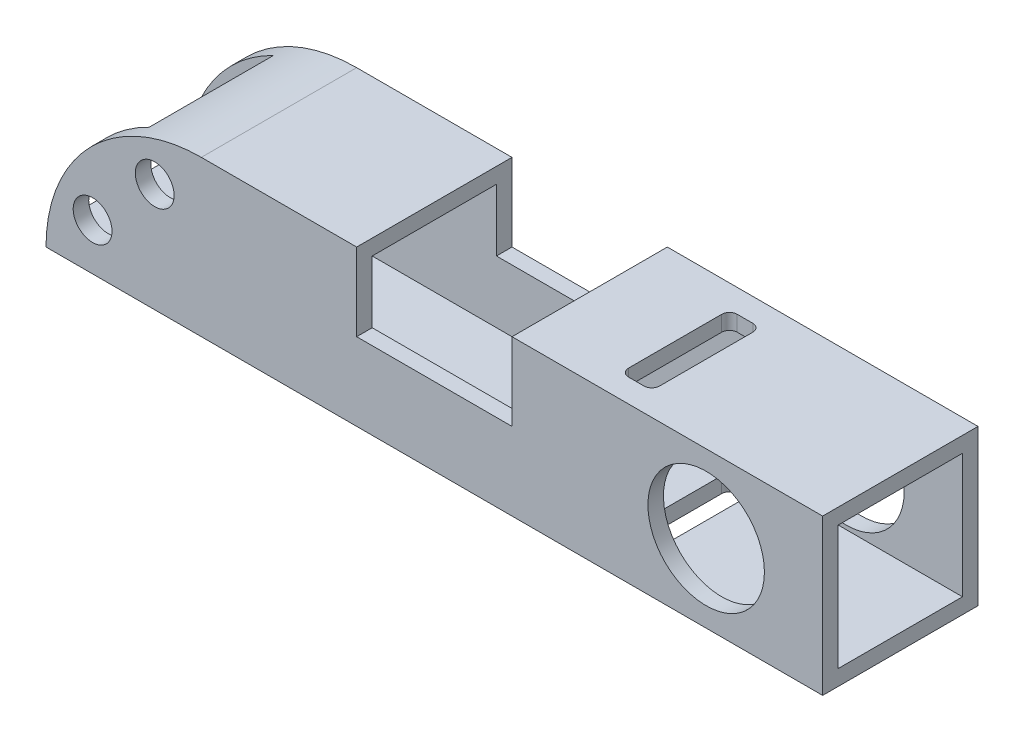
ISO-10303-21;
HEADER;
FILE_DESCRIPTION(('STEP AP214'),'2;1');
FILE_NAME('part.step','',(''),(''),'','','');
FILE_SCHEMA(('AUTOMOTIVE_DESIGN { 1 0 10303 214 1 1 1 1 }'));
ENDSEC;
DATA;
#1=APPLICATION_CONTEXT('core data for automotive mechanical design processes');
#2=APPLICATION_PROTOCOL_DEFINITION('international standard','automotive_design',2000,#1);
#3=PRODUCT_CONTEXT('',#1,'mechanical');
#4=PRODUCT('Part','Part','',(#3));
#5=PRODUCT_RELATED_PRODUCT_CATEGORY('part','',(#4));
#6=PRODUCT_DEFINITION_FORMATION('','',#4);
#7=PRODUCT_DEFINITION_CONTEXT('part definition',#1,'design');
#8=PRODUCT_DEFINITION('design','',#6,#7);
#9=PRODUCT_DEFINITION_SHAPE('','',#8);
#10=(LENGTH_UNIT() NAMED_UNIT(*) SI_UNIT(.MILLI.,.METRE.));
#11=(NAMED_UNIT(*) PLANE_ANGLE_UNIT() SI_UNIT($,.RADIAN.));
#12=(NAMED_UNIT(*) SI_UNIT($,.STERADIAN.) SOLID_ANGLE_UNIT());
#13=UNCERTAINTY_MEASURE_WITH_UNIT(LENGTH_MEASURE(1.E-05),#10,'distance_accuracy_value','');
#14=(GEOMETRIC_REPRESENTATION_CONTEXT(3) GLOBAL_UNCERTAINTY_ASSIGNED_CONTEXT((#13)) GLOBAL_UNIT_ASSIGNED_CONTEXT((#10,
#11,#12)) REPRESENTATION_CONTEXT('',''));
#15=CARTESIAN_POINT('',(0.,0.,0.));
#16=DIRECTION('',(0.,0.,1.));
#17=DIRECTION('',(1.,0.,0.));
#18=AXIS2_PLACEMENT_3D('',#15,#16,#17);
#19=CARTESIAN_POINT('',(127.,25.4,0.));
#20=DIRECTION('',(0.,-1.,0.));
#21=DIRECTION('',(0.,0.,-1.));
#22=AXIS2_PLACEMENT_3D('',#19,#20,#21);
#23=PLANE('',#22);
#24=DIRECTION('',(-1.,0.,0.));
#25=VECTOR('',#24,1.);
#26=CARTESIAN_POINT('',(127.,25.4,-25.4));
#27=LINE('',#26,#25);
#28=CARTESIAN_POINT('',(50.8,25.4,-25.4));
#29=VERTEX_POINT('',#28);
#30=CARTESIAN_POINT('',(25.4,25.4,-25.4));
#31=VERTEX_POINT('',#30);
#32=EDGE_CURVE('E534',#29,#31,#27,.T.);
#33=ORIENTED_EDGE('',*,*,#32,.T.);
#34=DIRECTION('',(0.,0.,1.));
#35=VECTOR('',#34,1.);
#36=CARTESIAN_POINT('',(25.4,25.4,0.));
#37=LINE('',#36,#35);
#38=CARTESIAN_POINT('',(25.4,25.4,0.));
#39=VERTEX_POINT('',#38);
#40=EDGE_CURVE('E558',#31,#39,#37,.T.);
#41=ORIENTED_EDGE('',*,*,#40,.T.);
#42=DIRECTION('',(-1.,0.,0.));
#43=VECTOR('',#42,1.);
#44=CARTESIAN_POINT('',(127.,25.4,0.));
#45=LINE('',#44,#43);
#46=CARTESIAN_POINT('',(50.8,25.4,0.));
#47=VERTEX_POINT('',#46);
#48=EDGE_CURVE('E527',#47,#39,#45,.T.);
#49=ORIENTED_EDGE('',*,*,#48,.F.);
#50=DIRECTION('',(0.,0.,1.));
#51=VECTOR('',#50,1.);
#52=CARTESIAN_POINT('',(50.8,25.4,-127.));
#53=LINE('',#52,#51);
#54=EDGE_CURVE('E439',#29,#47,#53,.T.);
#55=ORIENTED_EDGE('',*,*,#54,.F.);
#56=EDGE_LOOP('',(#33,#41,#49,#55));
#57=FACE_BOUND('',#56,.T.);
#58=ADVANCED_FACE('F50',(#57),#23,.F.);
#59=CARTESIAN_POINT('',(127.,22.86,-2.54));
#60=DIRECTION('',(0.,-1.,0.));
#61=DIRECTION('',(0.,0.,-1.));
#62=AXIS2_PLACEMENT_3D('',#59,#60,#61);
#63=PLANE('',#62);
#64=DIRECTION('',(0.,0.,-1.));
#65=VECTOR('',#64,1.);
#66=CARTESIAN_POINT('',(50.8,22.86,-2.54));
#67=LINE('',#66,#65);
#68=CARTESIAN_POINT('',(50.8,22.86,-2.54));
#69=VERTEX_POINT('',#68);
#70=CARTESIAN_POINT('',(50.8,22.86,-22.86));
#71=VERTEX_POINT('',#70);
#72=EDGE_CURVE('E549',#69,#71,#67,.T.);
#73=ORIENTED_EDGE('',*,*,#72,.F.);
#74=DIRECTION('',(-1.,0.,0.));
#75=VECTOR('',#74,1.);
#76=CARTESIAN_POINT('',(127.,22.86,-2.54));
#77=LINE('',#76,#75);
#78=CARTESIAN_POINT('',(14.3283966834067,22.86,-2.54));
#79=VERTEX_POINT('',#78);
#80=EDGE_CURVE('E497',#69,#79,#77,.T.);
#81=ORIENTED_EDGE('',*,*,#80,.T.);
#82=DIRECTION('',(0.,0.,-1.));
#83=VECTOR('',#82,1.);
#84=CARTESIAN_POINT('',(14.3283966834067,22.86,-12.7));
#85=LINE('',#84,#83);
#86=CARTESIAN_POINT('',(14.3283966834067,22.86,-22.86));
#87=VERTEX_POINT('',#86);
#88=EDGE_CURVE('E486',#87,#79,#85,.F.);
#89=ORIENTED_EDGE('',*,*,#88,.F.);
#90=DIRECTION('',(-1.,0.,0.));
#91=VECTOR('',#90,1.);
#92=CARTESIAN_POINT('',(127.,22.86,-22.86));
#93=LINE('',#92,#91);
#94=EDGE_CURVE('E503',#71,#87,#93,.T.);
#95=ORIENTED_EDGE('',*,*,#94,.F.);
#96=EDGE_LOOP('',(#73,#81,#89,#95));
#97=FACE_BOUND('',#96,.T.);
#98=ADVANCED_FACE('F912',(#97),#63,.T.);
#99=CARTESIAN_POINT('',(127.,25.4,0.));
#100=DIRECTION('',(-1.,0.,0.));
#101=DIRECTION('',(0.,0.,1.));
#102=AXIS2_PLACEMENT_3D('',#99,#100,#101);
#103=PLANE('',#102);
#104=DIRECTION('',(0.,-1.,0.));
#105=VECTOR('',#104,1.);
#106=CARTESIAN_POINT('',(127.,0.,0.));
#107=LINE('',#106,#105);
#108=CARTESIAN_POINT('',(127.,25.4,0.));
#109=VERTEX_POINT('',#108);
#110=CARTESIAN_POINT('',(127.,0.,0.));
#111=VERTEX_POINT('',#110);
#112=EDGE_CURVE('E514',#109,#111,#107,.T.);
#113=ORIENTED_EDGE('',*,*,#112,.T.);
#114=DIRECTION('',(0.,0.,-1.));
#115=VECTOR('',#114,1.);
#116=CARTESIAN_POINT('',(127.,0.,0.));
#117=LINE('',#116,#115);
#118=CARTESIAN_POINT('',(127.,0.,-25.4));
#119=VERTEX_POINT('',#118);
#120=EDGE_CURVE('E517',#111,#119,#117,.T.);
#121=ORIENTED_EDGE('',*,*,#120,.T.);
#122=DIRECTION('',(0.,1.,0.));
#123=VECTOR('',#122,1.);
#124=CARTESIAN_POINT('',(127.,0.,-25.4));
#125=LINE('',#124,#123);
#126=CARTESIAN_POINT('',(127.,25.4,-25.4));
#127=VERTEX_POINT('',#126);
#128=EDGE_CURVE('E524',#119,#127,#125,.T.);
#129=ORIENTED_EDGE('',*,*,#128,.T.);
#130=DIRECTION('',(0.,0.,1.));
#131=VECTOR('',#130,1.);
#132=CARTESIAN_POINT('',(127.,25.4,0.));
#133=LINE('',#132,#131);
#134=EDGE_CURVE('E523',#127,#109,#133,.T.);
#135=ORIENTED_EDGE('',*,*,#134,.T.);
#136=EDGE_LOOP('',(#113,#121,#129,#135));
#137=FACE_BOUND('',#136,.T.);
#138=DIRECTION('',(0.,-1.,0.));
#139=VECTOR('',#138,1.);
#140=CARTESIAN_POINT('',(127.,22.86,-2.54));
#141=LINE('',#140,#139);
#142=CARTESIAN_POINT('',(127.,22.86,-2.54));
#143=VERTEX_POINT('',#142);
#144=CARTESIAN_POINT('',(127.,2.54,-2.54));
#145=VERTEX_POINT('',#144);
#146=EDGE_CURVE('E485',#143,#145,#141,.T.);
#147=ORIENTED_EDGE('',*,*,#146,.F.);
#148=DIRECTION('',(0.,0.,1.));
#149=VECTOR('',#148,1.);
#150=CARTESIAN_POINT('',(127.,22.86,-2.54));
#151=LINE('',#150,#149);
#152=CARTESIAN_POINT('',(127.,22.86,-22.86));
#153=VERTEX_POINT('',#152);
#154=EDGE_CURVE('E492',#153,#143,#151,.T.);
#155=ORIENTED_EDGE('',*,*,#154,.F.);
#156=DIRECTION('',(0.,1.,0.));
#157=VECTOR('',#156,1.);
#158=CARTESIAN_POINT('',(127.,22.86,-22.86));
#159=LINE('',#158,#157);
#160=CARTESIAN_POINT('',(127.,2.54,-22.86));
#161=VERTEX_POINT('',#160);
#162=EDGE_CURVE('E487',#161,#153,#159,.T.);
#163=ORIENTED_EDGE('',*,*,#162,.F.);
#164=DIRECTION('',(0.,0.,-1.));
#165=VECTOR('',#164,1.);
#166=CARTESIAN_POINT('',(127.,2.54,-2.54));
#167=LINE('',#166,#165);
#168=EDGE_CURVE('E484',#145,#161,#167,.T.);
#169=ORIENTED_EDGE('',*,*,#168,.F.);
#170=EDGE_LOOP('',(#147,#155,#163,#169));
#171=FACE_BOUND('',#170,.T.);
#172=ADVANCED_FACE('F881',(#137,#171),#103,.F.);
#173=CARTESIAN_POINT('',(127.,0.,0.));
#174=DIRECTION('',(0.,0.,-1.));
#175=DIRECTION('',(-1.,0.,0.));
#176=AXIS2_PLACEMENT_3D('',#173,#174,#175);
#177=PLANE('',#176);
#178=CARTESIAN_POINT('',(107.95,12.7,0.));
#179=DIRECTION('',(0.,0.,1.));
#180=DIRECTION('',(1.,0.,0.));
#181=AXIS2_PLACEMENT_3D('',#178,#179,#180);
#182=CIRCLE('',#181,9.52500000000001);
#183=CARTESIAN_POINT('',(117.475,12.7,0.));
#184=VERTEX_POINT('',#183);
#185=EDGE_CURVE('E386',#184,#184,#182,.T.);
#186=ORIENTED_EDGE('',*,*,#185,.F.);
#187=EDGE_LOOP('',(#186));
#188=FACE_BOUND('',#187,.T.);
#189=CARTESIAN_POINT('',(17.78,17.78,0.));
#190=DIRECTION('',(0.,0.,1.));
#191=DIRECTION('',(1.,0.,0.));
#192=AXIS2_PLACEMENT_3D('',#189,#190,#191);
#193=CIRCLE('',#192,3.175);
#194=CARTESIAN_POINT('',(20.955,17.78,0.));
#195=VERTEX_POINT('',#194);
#196=EDGE_CURVE('E405',#195,#195,#193,.T.);
#197=ORIENTED_EDGE('',*,*,#196,.F.);
#198=EDGE_LOOP('',(#197));
#199=FACE_BOUND('',#198,.T.);
#200=CARTESIAN_POINT('',(7.62,7.62,0.));
#201=DIRECTION('',(0.,0.,1.));
#202=DIRECTION('',(1.,0.,0.));
#203=AXIS2_PLACEMENT_3D('',#200,#201,#202);
#204=CIRCLE('',#203,3.175);
#205=CARTESIAN_POINT('',(10.795,7.62,0.));
#206=VERTEX_POINT('',#205);
#207=EDGE_CURVE('E412',#206,#206,#204,.T.);
#208=ORIENTED_EDGE('',*,*,#207,.F.);
#209=EDGE_LOOP('',(#208));
#210=FACE_BOUND('',#209,.T.);
#211=ORIENTED_EDGE('',*,*,#48,.T.);
#212=CARTESIAN_POINT('',(25.4,0.,0.));
#213=DIRECTION('',(0.,0.,-1.));
#214=DIRECTION('',(-1.,0.,0.));
#215=AXIS2_PLACEMENT_3D('',#212,#213,#214);
#216=CIRCLE('',#215,25.4);
#217=CARTESIAN_POINT('',(0.,0.,0.));
#218=VERTEX_POINT('',#217);
#219=EDGE_CURVE('E556',#39,#218,#216,.F.);
#220=ORIENTED_EDGE('',*,*,#219,.T.);
#221=DIRECTION('',(-1.,0.,0.));
#222=VECTOR('',#221,1.);
#223=CARTESIAN_POINT('',(127.,0.,0.));
#224=LINE('',#223,#222);
#225=EDGE_CURVE('E543',#111,#218,#224,.T.);
#226=ORIENTED_EDGE('',*,*,#225,.F.);
#227=ORIENTED_EDGE('',*,*,#112,.F.);
#228=CARTESIAN_POINT('',(76.2,25.4,0.));
#229=VERTEX_POINT('',#228);
#230=EDGE_CURVE('E529',#109,#229,#45,.T.);
#231=ORIENTED_EDGE('',*,*,#230,.T.);
#232=DIRECTION('',(0.,1.,0.));
#233=VECTOR('',#232,1.);
#234=CARTESIAN_POINT('',(76.2,25.4,0.));
#235=LINE('',#234,#233);
#236=CARTESIAN_POINT('',(76.2,12.7,0.));
#237=VERTEX_POINT('',#236);
#238=EDGE_CURVE('E436',#237,#229,#235,.T.);
#239=ORIENTED_EDGE('',*,*,#238,.F.);
#240=DIRECTION('',(1.,0.,0.));
#241=VECTOR('',#240,1.);
#242=CARTESIAN_POINT('',(50.8,12.7,0.));
#243=LINE('',#242,#241);
#244=CARTESIAN_POINT('',(50.8,12.7,0.));
#245=VERTEX_POINT('',#244);
#246=EDGE_CURVE('E435',#245,#237,#243,.T.);
#247=ORIENTED_EDGE('',*,*,#246,.F.);
#248=DIRECTION('',(0.,-1.,0.));
#249=VECTOR('',#248,1.);
#250=CARTESIAN_POINT('',(50.8,25.4,0.));
#251=LINE('',#250,#249);
#252=EDGE_CURVE('E428',#47,#245,#251,.T.);
#253=ORIENTED_EDGE('',*,*,#252,.F.);
#254=EDGE_LOOP('',(#211,#220,#226,#227,#231,#239,#247,#253));
#255=FACE_BOUND('',#254,.T.);
#256=ADVANCED_FACE('F877',(#188,#199,#210,#255),#177,.F.);
#257=CARTESIAN_POINT('',(127.,0.,0.));
#258=DIRECTION('',(0.,1.,0.));
#259=DIRECTION('',(0.,0.,1.));
#260=AXIS2_PLACEMENT_3D('',#257,#258,#259);
#261=PLANE('',#260);
#262=DIRECTION('',(1.,0.,0.));
#263=VECTOR('',#262,1.);
#264=CARTESIAN_POINT('',(91.44,0.,-21.59));
#265=LINE('',#264,#263);
#266=CARTESIAN_POINT('',(91.44,0.,-21.59));
#267=VERTEX_POINT('',#266);
#268=CARTESIAN_POINT('',(93.98,0.,-21.59));
#269=VERTEX_POINT('',#268);
#270=EDGE_CURVE('E272',#267,#269,#265,.T.);
#271=ORIENTED_EDGE('',*,*,#270,.F.);
#272=CARTESIAN_POINT('',(91.44,0.,-20.32));
#273=DIRECTION('',(0.,-1.,0.));
#274=DIRECTION('',(0.,0.,1.));
#275=AXIS2_PLACEMENT_3D('',#272,#273,#274);
#276=CIRCLE('',#275,1.27000000000001);
#277=CARTESIAN_POINT('',(90.17,0.,-20.32));
#278=VERTEX_POINT('',#277);
#279=EDGE_CURVE('E62',#278,#267,#276,.T.);
#280=ORIENTED_EDGE('',*,*,#279,.F.);
#281=DIRECTION('',(0.,0.,-1.));
#282=VECTOR('',#281,1.);
#283=CARTESIAN_POINT('',(90.17,0.,-5.08));
#284=LINE('',#283,#282);
#285=CARTESIAN_POINT('',(90.17,0.,-5.08));
#286=VERTEX_POINT('',#285);
#287=EDGE_CURVE('E303',#286,#278,#284,.T.);
#288=ORIENTED_EDGE('',*,*,#287,.F.);
#289=CARTESIAN_POINT('',(91.44,0.,-5.08));
#290=DIRECTION('',(0.,-1.,0.));
#291=DIRECTION('',(0.,0.,-1.));
#292=AXIS2_PLACEMENT_3D('',#289,#290,#291);
#293=CIRCLE('',#292,1.26999999999999);
#294=CARTESIAN_POINT('',(91.44,0.,-3.81));
#295=VERTEX_POINT('',#294);
#296=EDGE_CURVE('E296',#295,#286,#293,.T.);
#297=ORIENTED_EDGE('',*,*,#296,.F.);
#298=DIRECTION('',(-1.,0.,0.));
#299=VECTOR('',#298,1.);
#300=CARTESIAN_POINT('',(91.44,0.,-3.81));
#301=LINE('',#300,#299);
#302=CARTESIAN_POINT('',(93.98,0.,-3.81000000000001));
#303=VERTEX_POINT('',#302);
#304=EDGE_CURVE('E298',#303,#295,#301,.T.);
#305=ORIENTED_EDGE('',*,*,#304,.F.);
#306=CARTESIAN_POINT('',(93.98,0.,-5.08));
#307=DIRECTION('',(0.,-1.,0.));
#308=DIRECTION('',(0.,0.,-1.));
#309=AXIS2_PLACEMENT_3D('',#306,#307,#308);
#310=CIRCLE('',#309,1.26999999999999);
#311=CARTESIAN_POINT('',(95.25,0.,-5.08));
#312=VERTEX_POINT('',#311);
#313=EDGE_CURVE('E288',#312,#303,#310,.T.);
#314=ORIENTED_EDGE('',*,*,#313,.F.);
#315=DIRECTION('',(0.,0.,1.));
#316=VECTOR('',#315,1.);
#317=CARTESIAN_POINT('',(95.25,0.,-5.08));
#318=LINE('',#317,#316);
#319=CARTESIAN_POINT('',(95.25,0.,-20.32));
#320=VERTEX_POINT('',#319);
#321=EDGE_CURVE('E282',#320,#312,#318,.T.);
#322=ORIENTED_EDGE('',*,*,#321,.F.);
#323=CARTESIAN_POINT('',(93.98,0.,-20.32));
#324=DIRECTION('',(0.,-1.,0.));
#325=DIRECTION('',(0.,0.,-1.));
#326=AXIS2_PLACEMENT_3D('',#323,#324,#325);
#327=CIRCLE('',#326,1.27000000000001);
#328=EDGE_CURVE('E263',#269,#320,#327,.T.);
#329=ORIENTED_EDGE('',*,*,#328,.F.);
#330=EDGE_LOOP('',(#271,#280,#288,#297,#305,#314,#322,#329));
#331=FACE_BOUND('',#330,.T.);
#332=DIRECTION('',(0.,0.,-1.));
#333=VECTOR('',#332,1.);
#334=CARTESIAN_POINT('',(0.,0.,0.));
#335=LINE('',#334,#333);
#336=CARTESIAN_POINT('',(0.,0.,-25.4));
#337=VERTEX_POINT('',#336);
#338=EDGE_CURVE('E511',#218,#337,#335,.T.);
#339=ORIENTED_EDGE('',*,*,#338,.T.);
#340=DIRECTION('',(-1.,0.,0.));
#341=VECTOR('',#340,1.);
#342=CARTESIAN_POINT('',(127.,0.,-25.4));
#343=LINE('',#342,#341);
#344=EDGE_CURVE('E537',#119,#337,#343,.T.);
#345=ORIENTED_EDGE('',*,*,#344,.F.);
#346=ORIENTED_EDGE('',*,*,#120,.F.);
#347=ORIENTED_EDGE('',*,*,#225,.T.);
#348=EDGE_LOOP('',(#339,#345,#346,#347));
#349=FACE_BOUND('',#348,.T.);
#350=ADVANCED_FACE('F276',(#331,#349),#261,.F.);
#351=CARTESIAN_POINT('',(127.,0.,-25.4));
#352=DIRECTION('',(0.,0.,1.));
#353=DIRECTION('',(1.,0.,0.));
#354=AXIS2_PLACEMENT_3D('',#351,#352,#353);
#355=PLANE('',#354);
#356=CARTESIAN_POINT('',(107.95,12.7,-25.4));
#357=DIRECTION('',(0.,0.,1.));
#358=DIRECTION('',(1.,0.,0.));
#359=AXIS2_PLACEMENT_3D('',#356,#357,#358);
#360=CIRCLE('',#359,9.52500000000001);
#361=CARTESIAN_POINT('',(117.475,12.7,-25.4));
#362=VERTEX_POINT('',#361);
#363=EDGE_CURVE('E400',#362,#362,#360,.T.);
#364=ORIENTED_EDGE('',*,*,#363,.T.);
#365=EDGE_LOOP('',(#364));
#366=FACE_BOUND('',#365,.T.);
#367=CARTESIAN_POINT('',(17.78,17.78,-25.4));
#368=DIRECTION('',(0.,0.,1.));
#369=DIRECTION('',(1.,0.,0.));
#370=AXIS2_PLACEMENT_3D('',#367,#368,#369);
#371=CIRCLE('',#370,3.175);
#372=CARTESIAN_POINT('',(20.955,17.78,-25.4));
#373=VERTEX_POINT('',#372);
#374=EDGE_CURVE('E414',#373,#373,#371,.T.);
#375=ORIENTED_EDGE('',*,*,#374,.T.);
#376=EDGE_LOOP('',(#375));
#377=FACE_BOUND('',#376,.T.);
#378=CARTESIAN_POINT('',(7.62,7.62,-25.4));
#379=DIRECTION('',(0.,0.,1.));
#380=DIRECTION('',(1.,0.,0.));
#381=AXIS2_PLACEMENT_3D('',#378,#379,#380);
#382=CIRCLE('',#381,3.175);
#383=CARTESIAN_POINT('',(10.795,7.62,-25.4));
#384=VERTEX_POINT('',#383);
#385=EDGE_CURVE('E424',#384,#384,#382,.T.);
#386=ORIENTED_EDGE('',*,*,#385,.T.);
#387=EDGE_LOOP('',(#386));
#388=FACE_BOUND('',#387,.T.);
#389=ORIENTED_EDGE('',*,*,#344,.T.);
#390=CARTESIAN_POINT('',(25.4,0.,-25.4));
#391=DIRECTION('',(0.,0.,1.));
#392=DIRECTION('',(1.,0.,0.));
#393=AXIS2_PLACEMENT_3D('',#390,#391,#392);
#394=CIRCLE('',#393,25.4);
#395=EDGE_CURVE('E565',#337,#31,#394,.F.);
#396=ORIENTED_EDGE('',*,*,#395,.T.);
#397=ORIENTED_EDGE('',*,*,#32,.F.);
#398=DIRECTION('',(0.,-1.,0.));
#399=VECTOR('',#398,1.);
#400=CARTESIAN_POINT('',(50.8,0.,-25.4));
#401=LINE('',#400,#399);
#402=CARTESIAN_POINT('',(50.8,12.7,-25.4));
#403=VERTEX_POINT('',#402);
#404=EDGE_CURVE('E467',#29,#403,#401,.T.);
#405=ORIENTED_EDGE('',*,*,#404,.T.);
#406=DIRECTION('',(1.,0.,0.));
#407=VECTOR('',#406,1.);
#408=CARTESIAN_POINT('',(127.,12.7,-25.4));
#409=LINE('',#408,#407);
#410=CARTESIAN_POINT('',(76.2,12.7,-25.4));
#411=VERTEX_POINT('',#410);
#412=EDGE_CURVE('E480',#403,#411,#409,.T.);
#413=ORIENTED_EDGE('',*,*,#412,.T.);
#414=DIRECTION('',(0.,1.,0.));
#415=VECTOR('',#414,1.);
#416=CARTESIAN_POINT('',(76.2,0.,-25.4));
#417=LINE('',#416,#415);
#418=CARTESIAN_POINT('',(76.2,25.4,-25.4));
#419=VERTEX_POINT('',#418);
#420=EDGE_CURVE('E458',#411,#419,#417,.T.);
#421=ORIENTED_EDGE('',*,*,#420,.T.);
#422=EDGE_CURVE('E532',#127,#419,#27,.T.);
#423=ORIENTED_EDGE('',*,*,#422,.F.);
#424=ORIENTED_EDGE('',*,*,#128,.F.);
#425=EDGE_LOOP('',(#389,#396,#397,#405,#413,#421,#423,#424));
#426=FACE_BOUND('',#425,.T.);
#427=ADVANCED_FACE('F897',(#366,#377,#388,#426),#355,.F.);
#428=DIRECTION('',(0.,0.,-1.));
#429=VECTOR('',#428,1.);
#430=CARTESIAN_POINT('',(90.17,25.4,0.));
#431=LINE('',#430,#429);
#432=CARTESIAN_POINT('',(90.17,25.4,-5.08));
#433=VERTEX_POINT('',#432);
#434=CARTESIAN_POINT('',(90.17,25.4,-20.32));
#435=VERTEX_POINT('',#434);
#436=EDGE_CURVE('E378',#433,#435,#431,.T.);
#437=ORIENTED_EDGE('',*,*,#436,.T.);
#438=CARTESIAN_POINT('',(91.44,25.4,-20.32));
#439=DIRECTION('',(0.,-1.,0.));
#440=DIRECTION('',(0.,0.,-1.));
#441=AXIS2_PLACEMENT_3D('',#438,#439,#440);
#442=CIRCLE('',#441,1.27000000000001);
#443=CARTESIAN_POINT('',(91.44,25.4,-21.59));
#444=VERTEX_POINT('',#443);
#445=EDGE_CURVE('E384',#435,#444,#442,.T.);
#446=ORIENTED_EDGE('',*,*,#445,.T.);
#447=DIRECTION('',(1.,0.,0.));
#448=VECTOR('',#447,1.);
#449=CARTESIAN_POINT('',(127.,25.4,-21.59));
#450=LINE('',#449,#448);
#451=CARTESIAN_POINT('',(93.98,25.4,-21.59));
#452=VERTEX_POINT('',#451);
#453=EDGE_CURVE('E339',#444,#452,#450,.T.);
#454=ORIENTED_EDGE('',*,*,#453,.T.);
#455=CARTESIAN_POINT('',(93.98,25.4,-20.32));
#456=DIRECTION('',(0.,-1.,0.));
#457=DIRECTION('',(0.,0.,-1.));
#458=AXIS2_PLACEMENT_3D('',#455,#456,#457);
#459=CIRCLE('',#458,1.27000000000001);
#460=CARTESIAN_POINT('',(95.25,25.4,-20.32));
#461=VERTEX_POINT('',#460);
#462=EDGE_CURVE('E345',#452,#461,#459,.T.);
#463=ORIENTED_EDGE('',*,*,#462,.T.);
#464=DIRECTION('',(0.,0.,1.));
#465=VECTOR('',#464,1.);
#466=CARTESIAN_POINT('',(95.25,25.4,0.));
#467=LINE('',#466,#465);
#468=CARTESIAN_POINT('',(95.25,25.4,-5.08));
#469=VERTEX_POINT('',#468);
#470=EDGE_CURVE('E348',#461,#469,#467,.T.);
#471=ORIENTED_EDGE('',*,*,#470,.T.);
#472=CARTESIAN_POINT('',(93.98,25.4,-5.08));
#473=DIRECTION('',(0.,-1.,0.));
#474=DIRECTION('',(0.,0.,-1.));
#475=AXIS2_PLACEMENT_3D('',#472,#473,#474);
#476=CIRCLE('',#475,1.26999999999999);
#477=CARTESIAN_POINT('',(93.98,25.4,-3.81000000000001));
#478=VERTEX_POINT('',#477);
#479=EDGE_CURVE('E356',#469,#478,#476,.T.);
#480=ORIENTED_EDGE('',*,*,#479,.T.);
#481=DIRECTION('',(-1.,0.,0.));
#482=VECTOR('',#481,1.);
#483=CARTESIAN_POINT('',(127.,25.4,-3.80999999999999));
#484=LINE('',#483,#482);
#485=CARTESIAN_POINT('',(91.44,25.4,-3.81));
#486=VERTEX_POINT('',#485);
#487=EDGE_CURVE('E365',#478,#486,#484,.T.);
#488=ORIENTED_EDGE('',*,*,#487,.T.);
#489=CARTESIAN_POINT('',(91.44,25.4,-5.08));
#490=DIRECTION('',(0.,-1.,0.));
#491=DIRECTION('',(0.,0.,-1.));
#492=AXIS2_PLACEMENT_3D('',#489,#490,#491);
#493=CIRCLE('',#492,1.26999999999999);
#494=EDGE_CURVE('E371',#486,#433,#493,.T.);
#495=ORIENTED_EDGE('',*,*,#494,.T.);
#496=EDGE_LOOP('',(#437,#446,#454,#463,#471,#480,#488,#495));
#497=FACE_BOUND('',#496,.T.);
#498=ORIENTED_EDGE('',*,*,#422,.T.);
#499=DIRECTION('',(0.,0.,1.));
#500=VECTOR('',#499,1.);
#501=CARTESIAN_POINT('',(76.2,25.4,-127.));
#502=LINE('',#501,#500);
#503=EDGE_CURVE('E441',#419,#229,#502,.T.);
#504=ORIENTED_EDGE('',*,*,#503,.T.);
#505=ORIENTED_EDGE('',*,*,#230,.F.);
#506=ORIENTED_EDGE('',*,*,#134,.F.);
#507=EDGE_LOOP('',(#498,#504,#505,#506));
#508=FACE_BOUND('',#507,.T.);
#509=ADVANCED_FACE('F894',(#497,#508),#23,.F.);
#510=CARTESIAN_POINT('',(127.,22.86,-2.54));
#511=DIRECTION('',(0.,0.,-1.));
#512=DIRECTION('',(0.,1.,0.));
#513=AXIS2_PLACEMENT_3D('',#510,#511,#512);
#514=PLANE('',#513);
#515=CARTESIAN_POINT('',(107.95,12.7,-2.54));
#516=DIRECTION('',(0.,0.,-1.));
#517=DIRECTION('',(0.,1.,0.));
#518=AXIS2_PLACEMENT_3D('',#515,#516,#517);
#519=CIRCLE('',#518,9.52500000000001);
#520=CARTESIAN_POINT('',(107.95,22.225,-2.54));
#521=VERTEX_POINT('',#520);
#522=EDGE_CURVE('E395',#521,#521,#519,.T.);
#523=ORIENTED_EDGE('',*,*,#522,.F.);
#524=EDGE_LOOP('',(#523));
#525=FACE_BOUND('',#524,.T.);
#526=CARTESIAN_POINT('',(17.78,17.78,-2.54));
#527=DIRECTION('',(0.,0.,-1.));
#528=DIRECTION('',(0.,1.,0.));
#529=AXIS2_PLACEMENT_3D('',#526,#527,#528);
#530=CIRCLE('',#529,3.175);
#531=CARTESIAN_POINT('',(17.78,20.955,-2.54));
#532=VERTEX_POINT('',#531);
#533=EDGE_CURVE('E409',#532,#532,#530,.T.);
#534=ORIENTED_EDGE('',*,*,#533,.F.);
#535=EDGE_LOOP('',(#534));
#536=FACE_BOUND('',#535,.T.);
#537=CARTESIAN_POINT('',(7.62,7.62,-2.54));
#538=DIRECTION('',(0.,0.,-1.));
#539=DIRECTION('',(0.,1.,0.));
#540=AXIS2_PLACEMENT_3D('',#537,#538,#539);
#541=CIRCLE('',#540,3.175);
#542=CARTESIAN_POINT('',(7.62,10.795,-2.54));
#543=VERTEX_POINT('',#542);
#544=EDGE_CURVE('E419',#543,#543,#541,.T.);
#545=ORIENTED_EDGE('',*,*,#544,.F.);
#546=EDGE_LOOP('',(#545));
#547=FACE_BOUND('',#546,.T.);
#548=DIRECTION('',(0.,1.,0.));
#549=VECTOR('',#548,1.);
#550=CARTESIAN_POINT('',(50.8,22.86,-2.54));
#551=LINE('',#550,#549);
#552=CARTESIAN_POINT('',(50.8,12.7,-2.54));
#553=VERTEX_POINT('',#552);
#554=EDGE_CURVE('E466',#553,#69,#551,.T.);
#555=ORIENTED_EDGE('',*,*,#554,.F.);
#556=DIRECTION('',(-1.,0.,0.));
#557=VECTOR('',#556,1.);
#558=CARTESIAN_POINT('',(127.,12.7,-2.54));
#559=LINE('',#558,#557);
#560=CARTESIAN_POINT('',(76.2,12.7,-2.54));
#561=VERTEX_POINT('',#560);
#562=EDGE_CURVE('E475',#561,#553,#559,.T.);
#563=ORIENTED_EDGE('',*,*,#562,.F.);
#564=DIRECTION('',(0.,-1.,0.));
#565=VECTOR('',#564,1.);
#566=CARTESIAN_POINT('',(76.2,22.86,-2.54));
#567=LINE('',#566,#565);
#568=CARTESIAN_POINT('',(76.2,22.86,-2.54));
#569=VERTEX_POINT('',#568);
#570=EDGE_CURVE('E460',#569,#561,#567,.T.);
#571=ORIENTED_EDGE('',*,*,#570,.F.);
#572=EDGE_CURVE('E500',#143,#569,#77,.T.);
#573=ORIENTED_EDGE('',*,*,#572,.F.);
#574=ORIENTED_EDGE('',*,*,#146,.T.);
#575=DIRECTION('',(-1.,0.,0.));
#576=VECTOR('',#575,1.);
#577=CARTESIAN_POINT('',(127.,2.54,-2.54));
#578=LINE('',#577,#576);
#579=CARTESIAN_POINT('',(0.127319097491859,2.54,-2.54));
#580=VERTEX_POINT('',#579);
#581=EDGE_CURVE('E508',#145,#580,#578,.T.);
#582=ORIENTED_EDGE('',*,*,#581,.T.);
#583=CARTESIAN_POINT('',(25.4,0.,-2.54));
#584=DIRECTION('',(0.,0.,-1.));
#585=DIRECTION('',(0.,1.,0.));
#586=AXIS2_PLACEMENT_3D('',#583,#584,#585);
#587=CIRCLE('',#586,25.4);
#588=EDGE_CURVE('E481',#79,#580,#587,.F.);
#589=ORIENTED_EDGE('',*,*,#588,.F.);
#590=ORIENTED_EDGE('',*,*,#80,.F.);
#591=EDGE_LOOP('',(#555,#563,#571,#573,#574,#582,#589,#590));
#592=FACE_BOUND('',#591,.T.);
#593=ADVANCED_FACE('F926',(#525,#536,#547,#592),#514,.T.);
#594=CARTESIAN_POINT('',(127.,2.54,-2.54));
#595=DIRECTION('',(0.,1.,0.));
#596=DIRECTION('',(0.,0.,1.));
#597=AXIS2_PLACEMENT_3D('',#594,#595,#596);
#598=PLANE('',#597);
#599=CARTESIAN_POINT('',(91.44,2.54,-20.32));
#600=DIRECTION('',(0.,1.,0.));
#601=DIRECTION('',(0.,0.,1.));
#602=AXIS2_PLACEMENT_3D('',#599,#600,#601);
#603=CIRCLE('',#602,1.27000000000001);
#604=CARTESIAN_POINT('',(91.44,2.54,-21.59));
#605=VERTEX_POINT('',#604);
#606=CARTESIAN_POINT('',(90.17,2.54,-20.32));
#607=VERTEX_POINT('',#606);
#608=EDGE_CURVE('E385',#605,#607,#603,.T.);
#609=ORIENTED_EDGE('',*,*,#608,.F.);
#610=DIRECTION('',(-1.,0.,0.));
#611=VECTOR('',#610,1.);
#612=CARTESIAN_POINT('',(127.,2.54,-21.59));
#613=LINE('',#612,#611);
#614=CARTESIAN_POINT('',(93.98,2.54,-21.59));
#615=VERTEX_POINT('',#614);
#616=EDGE_CURVE('E331',#615,#605,#613,.T.);
#617=ORIENTED_EDGE('',*,*,#616,.F.);
#618=CARTESIAN_POINT('',(93.98,2.54,-20.32));
#619=DIRECTION('',(0.,1.,0.));
#620=DIRECTION('',(0.,0.,1.));
#621=AXIS2_PLACEMENT_3D('',#618,#619,#620);
#622=CIRCLE('',#621,1.27000000000001);
#623=CARTESIAN_POINT('',(95.25,2.54,-20.32));
#624=VERTEX_POINT('',#623);
#625=EDGE_CURVE('E266',#624,#615,#622,.T.);
#626=ORIENTED_EDGE('',*,*,#625,.F.);
#627=DIRECTION('',(0.,0.,-1.));
#628=VECTOR('',#627,1.);
#629=CARTESIAN_POINT('',(95.25,2.54,-2.54000000000006));
#630=LINE('',#629,#628);
#631=CARTESIAN_POINT('',(95.25,2.54,-5.08));
#632=VERTEX_POINT('',#631);
#633=EDGE_CURVE('E350',#632,#624,#630,.T.);
#634=ORIENTED_EDGE('',*,*,#633,.F.);
#635=CARTESIAN_POINT('',(93.98,2.54,-5.08));
#636=DIRECTION('',(0.,1.,0.));
#637=DIRECTION('',(0.,0.,1.));
#638=AXIS2_PLACEMENT_3D('',#635,#636,#637);
#639=CIRCLE('',#638,1.26999999999999);
#640=CARTESIAN_POINT('',(93.98,2.54,-3.81000000000001));
#641=VERTEX_POINT('',#640);
#642=EDGE_CURVE('E355',#641,#632,#639,.T.);
#643=ORIENTED_EDGE('',*,*,#642,.F.);
#644=DIRECTION('',(1.,0.,0.));
#645=VECTOR('',#644,1.);
#646=CARTESIAN_POINT('',(127.,2.54,-3.80999999999999));
#647=LINE('',#646,#645);
#648=CARTESIAN_POINT('',(91.44,2.54,-3.81));
#649=VERTEX_POINT('',#648);
#650=EDGE_CURVE('E363',#649,#641,#647,.T.);
#651=ORIENTED_EDGE('',*,*,#650,.F.);
#652=CARTESIAN_POINT('',(91.44,2.54,-5.08));
#653=DIRECTION('',(0.,1.,0.));
#654=DIRECTION('',(0.,0.,1.));
#655=AXIS2_PLACEMENT_3D('',#652,#653,#654);
#656=CIRCLE('',#655,1.26999999999999);
#657=CARTESIAN_POINT('',(90.17,2.54,-5.08));
#658=VERTEX_POINT('',#657);
#659=EDGE_CURVE('E366',#658,#649,#656,.T.);
#660=ORIENTED_EDGE('',*,*,#659,.F.);
#661=DIRECTION('',(0.,0.,1.));
#662=VECTOR('',#661,1.);
#663=CARTESIAN_POINT('',(90.17,2.54,-2.53999999999994));
#664=LINE('',#663,#662);
#665=EDGE_CURVE('E374',#607,#658,#664,.T.);
#666=ORIENTED_EDGE('',*,*,#665,.F.);
#667=EDGE_LOOP('',(#609,#617,#626,#634,#643,#651,#660,#666));
#668=FACE_BOUND('',#667,.T.);
#669=DIRECTION('',(0.,0.,-1.));
#670=VECTOR('',#669,1.);
#671=CARTESIAN_POINT('',(0.127319097491859,2.54,-12.7));
#672=LINE('',#671,#670);
#673=CARTESIAN_POINT('',(0.127319097491859,2.54,-22.86));
#674=VERTEX_POINT('',#673);
#675=EDGE_CURVE('E575',#580,#674,#672,.T.);
#676=ORIENTED_EDGE('',*,*,#675,.F.);
#677=ORIENTED_EDGE('',*,*,#581,.F.);
#678=ORIENTED_EDGE('',*,*,#168,.T.);
#679=DIRECTION('',(-1.,0.,0.));
#680=VECTOR('',#679,1.);
#681=CARTESIAN_POINT('',(127.,2.54,-22.86));
#682=LINE('',#681,#680);
#683=EDGE_CURVE('E509',#161,#674,#682,.T.);
#684=ORIENTED_EDGE('',*,*,#683,.T.);
#685=EDGE_LOOP('',(#676,#677,#678,#684));
#686=FACE_BOUND('',#685,.T.);
#687=ADVANCED_FACE('F932',(#668,#686),#598,.T.);
#688=CARTESIAN_POINT('',(127.,22.86,-22.86));
#689=DIRECTION('',(0.,0.,1.));
#690=DIRECTION('',(0.,-1.,0.));
#691=AXIS2_PLACEMENT_3D('',#688,#689,#690);
#692=PLANE('',#691);
#693=CARTESIAN_POINT('',(107.95,12.7,-22.86));
#694=DIRECTION('',(0.,0.,1.));
#695=DIRECTION('',(0.,-1.,0.));
#696=AXIS2_PLACEMENT_3D('',#693,#694,#695);
#697=CIRCLE('',#696,9.52500000000001);
#698=CARTESIAN_POINT('',(107.95,3.17499999999999,-22.86));
#699=VERTEX_POINT('',#698);
#700=EDGE_CURVE('E392',#699,#699,#697,.T.);
#701=ORIENTED_EDGE('',*,*,#700,.F.);
#702=EDGE_LOOP('',(#701));
#703=FACE_BOUND('',#702,.T.);
#704=CARTESIAN_POINT('',(17.78,17.78,-22.86));
#705=DIRECTION('',(0.,0.,1.));
#706=DIRECTION('',(0.,-1.,0.));
#707=AXIS2_PLACEMENT_3D('',#704,#705,#706);
#708=CIRCLE('',#707,3.175);
#709=CARTESIAN_POINT('',(17.78,14.605,-22.86));
#710=VERTEX_POINT('',#709);
#711=EDGE_CURVE('E408',#710,#710,#708,.T.);
#712=ORIENTED_EDGE('',*,*,#711,.F.);
#713=EDGE_LOOP('',(#712));
#714=FACE_BOUND('',#713,.T.);
#715=CARTESIAN_POINT('',(7.62,7.62,-22.86));
#716=DIRECTION('',(0.,0.,1.));
#717=DIRECTION('',(0.,-1.,0.));
#718=AXIS2_PLACEMENT_3D('',#715,#716,#717);
#719=CIRCLE('',#718,3.175);
#720=CARTESIAN_POINT('',(7.62,4.445,-22.86));
#721=VERTEX_POINT('',#720);
#722=EDGE_CURVE('E420',#721,#721,#719,.T.);
#723=ORIENTED_EDGE('',*,*,#722,.F.);
#724=EDGE_LOOP('',(#723));
#725=FACE_BOUND('',#724,.T.);
#726=DIRECTION('',(0.,-1.,0.));
#727=VECTOR('',#726,1.);
#728=CARTESIAN_POINT('',(50.8,22.86,-22.86));
#729=LINE('',#728,#727);
#730=CARTESIAN_POINT('',(50.8,12.7,-22.86));
#731=VERTEX_POINT('',#730);
#732=EDGE_CURVE('E465',#71,#731,#729,.T.);
#733=ORIENTED_EDGE('',*,*,#732,.F.);
#734=ORIENTED_EDGE('',*,*,#94,.T.);
#735=CARTESIAN_POINT('',(25.4,0.,-22.86));
#736=DIRECTION('',(0.,0.,1.));
#737=DIRECTION('',(0.,-1.,0.));
#738=AXIS2_PLACEMENT_3D('',#735,#736,#737);
#739=CIRCLE('',#738,25.4);
#740=EDGE_CURVE('E568',#674,#87,#739,.F.);
#741=ORIENTED_EDGE('',*,*,#740,.F.);
#742=ORIENTED_EDGE('',*,*,#683,.F.);
#743=ORIENTED_EDGE('',*,*,#162,.T.);
#744=CARTESIAN_POINT('',(76.2,22.86,-22.86));
#745=VERTEX_POINT('',#744);
#746=EDGE_CURVE('E504',#153,#745,#93,.T.);
#747=ORIENTED_EDGE('',*,*,#746,.T.);
#748=DIRECTION('',(0.,1.,0.));
#749=VECTOR('',#748,1.);
#750=CARTESIAN_POINT('',(76.2,22.86,-22.86));
#751=LINE('',#750,#749);
#752=CARTESIAN_POINT('',(76.2,12.7,-22.86));
#753=VERTEX_POINT('',#752);
#754=EDGE_CURVE('E444',#753,#745,#751,.T.);
#755=ORIENTED_EDGE('',*,*,#754,.F.);
#756=DIRECTION('',(1.,0.,0.));
#757=VECTOR('',#756,1.);
#758=CARTESIAN_POINT('',(127.,12.7,-22.86));
#759=LINE('',#758,#757);
#760=EDGE_CURVE('E554',#731,#753,#759,.T.);
#761=ORIENTED_EDGE('',*,*,#760,.F.);
#762=EDGE_LOOP('',(#733,#734,#741,#742,#743,#747,#755,#761));
#763=FACE_BOUND('',#762,.T.);
#764=ADVANCED_FACE('F906',(#703,#714,#725,#763),#692,.T.);
#765=CARTESIAN_POINT('',(91.44,22.86,-20.32));
#766=DIRECTION('',(0.,-1.,0.));
#767=DIRECTION('',(0.,0.,-1.));
#768=AXIS2_PLACEMENT_3D('',#765,#766,#767);
#769=CIRCLE('',#768,1.27000000000001);
#770=CARTESIAN_POINT('',(90.17,22.86,-20.32));
#771=VERTEX_POINT('',#770);
#772=CARTESIAN_POINT('',(91.44,22.86,-21.59));
#773=VERTEX_POINT('',#772);
#774=EDGE_CURVE('E11',#771,#773,#769,.T.);
#775=ORIENTED_EDGE('',*,*,#774,.F.);
#776=DIRECTION('',(0.,0.,-1.));
#777=VECTOR('',#776,1.);
#778=CARTESIAN_POINT('',(90.17,22.86,-2.53999999999993));
#779=LINE('',#778,#777);
#780=CARTESIAN_POINT('',(90.17,22.86,-5.08));
#781=VERTEX_POINT('',#780);
#782=EDGE_CURVE('E57',#781,#771,#779,.T.);
#783=ORIENTED_EDGE('',*,*,#782,.F.);
#784=CARTESIAN_POINT('',(91.44,22.86,-5.08));
#785=DIRECTION('',(0.,-1.,0.));
#786=DIRECTION('',(0.,0.,-1.));
#787=AXIS2_PLACEMENT_3D('',#784,#785,#786);
#788=CIRCLE('',#787,1.26999999999999);
#789=CARTESIAN_POINT('',(91.44,22.86,-3.81));
#790=VERTEX_POINT('',#789);
#791=EDGE_CURVE('E603',#790,#781,#788,.T.);
#792=ORIENTED_EDGE('',*,*,#791,.F.);
#793=DIRECTION('',(-1.,0.,0.));
#794=VECTOR('',#793,1.);
#795=CARTESIAN_POINT('',(127.,22.86,-3.80999999999999));
#796=LINE('',#795,#794);
#797=CARTESIAN_POINT('',(93.98,22.86,-3.81000000000001));
#798=VERTEX_POINT('',#797);
#799=EDGE_CURVE('E601',#798,#790,#796,.T.);
#800=ORIENTED_EDGE('',*,*,#799,.F.);
#801=CARTESIAN_POINT('',(93.98,22.86,-5.08));
#802=DIRECTION('',(0.,-1.,0.));
#803=DIRECTION('',(0.,0.,-1.));
#804=AXIS2_PLACEMENT_3D('',#801,#802,#803);
#805=CIRCLE('',#804,1.26999999999999);
#806=CARTESIAN_POINT('',(95.25,22.86,-5.08));
#807=VERTEX_POINT('',#806);
#808=EDGE_CURVE('E598',#807,#798,#805,.T.);
#809=ORIENTED_EDGE('',*,*,#808,.F.);
#810=DIRECTION('',(0.,0.,1.));
#811=VECTOR('',#810,1.);
#812=CARTESIAN_POINT('',(95.25,22.86,-2.54000000000006));
#813=LINE('',#812,#811);
#814=CARTESIAN_POINT('',(95.25,22.86,-20.32));
#815=VERTEX_POINT('',#814);
#816=EDGE_CURVE('E594',#815,#807,#813,.T.);
#817=ORIENTED_EDGE('',*,*,#816,.F.);
#818=CARTESIAN_POINT('',(93.98,22.86,-20.32));
#819=DIRECTION('',(0.,-1.,0.));
#820=DIRECTION('',(0.,0.,-1.));
#821=AXIS2_PLACEMENT_3D('',#818,#819,#820);
#822=CIRCLE('',#821,1.27000000000001);
#823=CARTESIAN_POINT('',(93.98,22.86,-21.59));
#824=VERTEX_POINT('',#823);
#825=EDGE_CURVE('E595',#824,#815,#822,.T.);
#826=ORIENTED_EDGE('',*,*,#825,.F.);
#827=DIRECTION('',(1.,0.,0.));
#828=VECTOR('',#827,1.);
#829=CARTESIAN_POINT('',(127.,22.86,-21.59));
#830=LINE('',#829,#828);
#831=EDGE_CURVE('E567',#773,#824,#830,.T.);
#832=ORIENTED_EDGE('',*,*,#831,.F.);
#833=EDGE_LOOP('',(#775,#783,#792,#800,#809,#817,#826,#832));
#834=FACE_BOUND('',#833,.T.);
#835=DIRECTION('',(0.,0.,1.));
#836=VECTOR('',#835,1.);
#837=CARTESIAN_POINT('',(76.2,22.86,-2.54));
#838=LINE('',#837,#836);
#839=EDGE_CURVE('E550',#745,#569,#838,.T.);
#840=ORIENTED_EDGE('',*,*,#839,.F.);
#841=ORIENTED_EDGE('',*,*,#746,.F.);
#842=ORIENTED_EDGE('',*,*,#154,.T.);
#843=ORIENTED_EDGE('',*,*,#572,.T.);
#844=EDGE_LOOP('',(#840,#841,#842,#843));
#845=FACE_BOUND('',#844,.T.);
#846=ADVANCED_FACE('F624',(#834,#845),#63,.T.);
#847=CARTESIAN_POINT('',(50.8,12.7,-127.));
#848=DIRECTION('',(0.,-1.,0.));
#849=DIRECTION('',(0.,0.,-1.));
#850=AXIS2_PLACEMENT_3D('',#847,#848,#849);
#851=PLANE('',#850);
#852=DIRECTION('',(0.,0.,1.));
#853=VECTOR('',#852,1.);
#854=CARTESIAN_POINT('',(50.8,12.7,-127.));
#855=LINE('',#854,#853);
#856=EDGE_CURVE('E451',#403,#731,#855,.T.);
#857=ORIENTED_EDGE('',*,*,#856,.T.);
#858=ORIENTED_EDGE('',*,*,#760,.T.);
#859=DIRECTION('',(0.,0.,1.));
#860=VECTOR('',#859,1.);
#861=CARTESIAN_POINT('',(76.2,12.7,-127.));
#862=LINE('',#861,#860);
#863=EDGE_CURVE('E447',#411,#753,#862,.T.);
#864=ORIENTED_EDGE('',*,*,#863,.F.);
#865=ORIENTED_EDGE('',*,*,#412,.F.);
#866=EDGE_LOOP('',(#857,#858,#864,#865));
#867=FACE_BOUND('',#866,.T.);
#868=ADVANCED_FACE('F899',(#867),#851,.F.);
#869=ORIENTED_EDGE('',*,*,#562,.T.);
#870=EDGE_CURVE('E438',#553,#245,#855,.T.);
#871=ORIENTED_EDGE('',*,*,#870,.T.);
#872=ORIENTED_EDGE('',*,*,#246,.T.);
#873=EDGE_CURVE('E450',#561,#237,#862,.T.);
#874=ORIENTED_EDGE('',*,*,#873,.F.);
#875=EDGE_LOOP('',(#869,#871,#872,#874));
#876=FACE_BOUND('',#875,.T.);
#877=ADVANCED_FACE('F931',(#876),#851,.F.);
#878=CARTESIAN_POINT('',(50.8,25.4,-127.));
#879=DIRECTION('',(-1.,0.,0.));
#880=DIRECTION('',(0.,0.,1.));
#881=AXIS2_PLACEMENT_3D('',#878,#879,#880);
#882=PLANE('',#881);
#883=ORIENTED_EDGE('',*,*,#54,.T.);
#884=ORIENTED_EDGE('',*,*,#252,.T.);
#885=ORIENTED_EDGE('',*,*,#870,.F.);
#886=ORIENTED_EDGE('',*,*,#554,.T.);
#887=ORIENTED_EDGE('',*,*,#72,.T.);
#888=ORIENTED_EDGE('',*,*,#732,.T.);
#889=ORIENTED_EDGE('',*,*,#856,.F.);
#890=ORIENTED_EDGE('',*,*,#404,.F.);
#891=EDGE_LOOP('',(#883,#884,#885,#886,#887,#888,#889,#890));
#892=FACE_BOUND('',#891,.T.);
#893=ADVANCED_FACE('F904',(#892),#882,.F.);
#894=CARTESIAN_POINT('',(76.2,25.4,-127.));
#895=DIRECTION('',(1.,0.,0.));
#896=DIRECTION('',(0.,0.,-1.));
#897=AXIS2_PLACEMENT_3D('',#894,#895,#896);
#898=PLANE('',#897);
#899=ORIENTED_EDGE('',*,*,#863,.T.);
#900=ORIENTED_EDGE('',*,*,#754,.T.);
#901=ORIENTED_EDGE('',*,*,#839,.T.);
#902=ORIENTED_EDGE('',*,*,#570,.T.);
#903=ORIENTED_EDGE('',*,*,#873,.T.);
#904=ORIENTED_EDGE('',*,*,#238,.T.);
#905=ORIENTED_EDGE('',*,*,#503,.F.);
#906=ORIENTED_EDGE('',*,*,#420,.F.);
#907=EDGE_LOOP('',(#899,#900,#901,#902,#903,#904,#905,#906));
#908=FACE_BOUND('',#907,.T.);
#909=ADVANCED_FACE('F893',(#908),#898,.F.);
#910=CARTESIAN_POINT('',(25.4,0.,0.));
#911=DIRECTION('',(0.,0.,-1.));
#912=DIRECTION('',(-1.,0.,0.));
#913=AXIS2_PLACEMENT_3D('',#910,#911,#912);
#914=CYLINDRICAL_SURFACE('',#913,25.4);
#915=ORIENTED_EDGE('',*,*,#395,.F.);
#916=ORIENTED_EDGE('',*,*,#338,.F.);
#917=ORIENTED_EDGE('',*,*,#219,.F.);
#918=ORIENTED_EDGE('',*,*,#40,.F.);
#919=EDGE_LOOP('',(#915,#916,#917,#918));
#920=FACE_BOUND('',#919,.T.);
#921=ORIENTED_EDGE('',*,*,#88,.T.);
#922=ORIENTED_EDGE('',*,*,#588,.T.);
#923=ORIENTED_EDGE('',*,*,#675,.T.);
#924=ORIENTED_EDGE('',*,*,#740,.T.);
#925=EDGE_LOOP('',(#921,#922,#923,#924));
#926=FACE_BOUND('',#925,.T.);
#927=ADVANCED_FACE('F47',(#920,#926),#914,.T.);
#928=CARTESIAN_POINT('',(7.62,7.62,-127.));
#929=DIRECTION('',(0.,0.,1.));
#930=DIRECTION('',(1.,0.,0.));
#931=AXIS2_PLACEMENT_3D('',#928,#929,#930);
#932=CYLINDRICAL_SURFACE('',#931,3.175);
#933=ORIENTED_EDGE('',*,*,#722,.T.);
#934=EDGE_LOOP('',(#933));
#935=FACE_BOUND('',#934,.T.);
#936=ORIENTED_EDGE('',*,*,#385,.F.);
#937=EDGE_LOOP('',(#936));
#938=FACE_BOUND('',#937,.T.);
#939=ADVANCED_FACE('F1050',(#935,#938),#932,.F.);
#940=ORIENTED_EDGE('',*,*,#544,.T.);
#941=EDGE_LOOP('',(#940));
#942=FACE_BOUND('',#941,.T.);
#943=ORIENTED_EDGE('',*,*,#207,.T.);
#944=EDGE_LOOP('',(#943));
#945=FACE_BOUND('',#944,.T.);
#946=ADVANCED_FACE('F1044',(#942,#945),#932,.F.);
#947=CARTESIAN_POINT('',(17.78,17.78,-127.));
#948=DIRECTION('',(0.,0.,1.));
#949=DIRECTION('',(1.,0.,0.));
#950=AXIS2_PLACEMENT_3D('',#947,#948,#949);
#951=CYLINDRICAL_SURFACE('',#950,3.175);
#952=ORIENTED_EDGE('',*,*,#711,.T.);
#953=EDGE_LOOP('',(#952));
#954=FACE_BOUND('',#953,.T.);
#955=ORIENTED_EDGE('',*,*,#374,.F.);
#956=EDGE_LOOP('',(#955));
#957=FACE_BOUND('',#956,.T.);
#958=ADVANCED_FACE('F1045',(#954,#957),#951,.F.);
#959=ORIENTED_EDGE('',*,*,#533,.T.);
#960=EDGE_LOOP('',(#959));
#961=FACE_BOUND('',#960,.T.);
#962=ORIENTED_EDGE('',*,*,#196,.T.);
#963=EDGE_LOOP('',(#962));
#964=FACE_BOUND('',#963,.T.);
#965=ADVANCED_FACE('F1039',(#961,#964),#951,.F.);
#966=CARTESIAN_POINT('',(107.95,12.7,-127.));
#967=DIRECTION('',(0.,0.,1.));
#968=DIRECTION('',(1.,0.,0.));
#969=AXIS2_PLACEMENT_3D('',#966,#967,#968);
#970=CYLINDRICAL_SURFACE('',#969,9.52500000000001);
#971=ORIENTED_EDGE('',*,*,#700,.T.);
#972=EDGE_LOOP('',(#971));
#973=FACE_BOUND('',#972,.T.);
#974=ORIENTED_EDGE('',*,*,#363,.F.);
#975=EDGE_LOOP('',(#974));
#976=FACE_BOUND('',#975,.T.);
#977=ADVANCED_FACE('F1036',(#973,#976),#970,.F.);
#978=ORIENTED_EDGE('',*,*,#522,.T.);
#979=EDGE_LOOP('',(#978));
#980=FACE_BOUND('',#979,.T.);
#981=ORIENTED_EDGE('',*,*,#185,.T.);
#982=EDGE_LOOP('',(#981));
#983=FACE_BOUND('',#982,.T.);
#984=ADVANCED_FACE('F1037',(#980,#983),#970,.F.);
#985=CARTESIAN_POINT('',(91.44,127.,-21.59));
#986=DIRECTION('',(0.,0.,-1.));
#987=DIRECTION('',(-1.,0.,0.));
#988=AXIS2_PLACEMENT_3D('',#985,#986,#987);
#989=PLANE('',#988);
#990=DIRECTION('',(0.,-1.,0.));
#991=VECTOR('',#990,1.);
#992=CARTESIAN_POINT('',(91.44,127.,-21.59));
#993=LINE('',#992,#991);
#994=EDGE_CURVE('E269',#444,#773,#993,.T.);
#995=ORIENTED_EDGE('',*,*,#994,.T.);
#996=ORIENTED_EDGE('',*,*,#831,.T.);
#997=DIRECTION('',(0.,-1.,0.));
#998=VECTOR('',#997,1.);
#999=CARTESIAN_POINT('',(93.98,127.,-21.59));
#1000=LINE('',#999,#998);
#1001=EDGE_CURVE('E72',#452,#824,#1000,.T.);
#1002=ORIENTED_EDGE('',*,*,#1001,.F.);
#1003=ORIENTED_EDGE('',*,*,#453,.F.);
#1004=EDGE_LOOP('',(#995,#996,#1002,#1003));
#1005=FACE_BOUND('',#1004,.T.);
#1006=ADVANCED_FACE('F627',(#1005),#989,.F.);
#1007=CARTESIAN_POINT('',(93.98,127.,-20.32));
#1008=DIRECTION('',(0.,-1.,0.));
#1009=DIRECTION('',(0.,0.,-1.));
#1010=AXIS2_PLACEMENT_3D('',#1007,#1008,#1009);
#1011=CYLINDRICAL_SURFACE('',#1010,1.27000000000001);
#1012=ORIENTED_EDGE('',*,*,#1001,.T.);
#1013=ORIENTED_EDGE('',*,*,#825,.T.);
#1014=DIRECTION('',(0.,-1.,0.));
#1015=VECTOR('',#1014,1.);
#1016=CARTESIAN_POINT('',(95.25,127.,-20.32));
#1017=LINE('',#1016,#1015);
#1018=EDGE_CURVE('E327',#461,#815,#1017,.T.);
#1019=ORIENTED_EDGE('',*,*,#1018,.F.);
#1020=ORIENTED_EDGE('',*,*,#462,.F.);
#1021=EDGE_LOOP('',(#1012,#1013,#1019,#1020));
#1022=FACE_BOUND('',#1021,.T.);
#1023=ADVANCED_FACE('F626',(#1022),#1011,.F.);
#1024=CARTESIAN_POINT('',(95.25,127.,-5.08));
#1025=DIRECTION('',(1.,0.,0.));
#1026=DIRECTION('',(0.,0.,-1.));
#1027=AXIS2_PLACEMENT_3D('',#1024,#1025,#1026);
#1028=PLANE('',#1027);
#1029=ORIENTED_EDGE('',*,*,#1018,.T.);
#1030=ORIENTED_EDGE('',*,*,#816,.T.);
#1031=DIRECTION('',(0.,-1.,0.));
#1032=VECTOR('',#1031,1.);
#1033=CARTESIAN_POINT('',(95.25,127.,-5.08));
#1034=LINE('',#1033,#1032);
#1035=EDGE_CURVE('E322',#469,#807,#1034,.T.);
#1036=ORIENTED_EDGE('',*,*,#1035,.F.);
#1037=ORIENTED_EDGE('',*,*,#470,.F.);
#1038=EDGE_LOOP('',(#1029,#1030,#1036,#1037));
#1039=FACE_BOUND('',#1038,.T.);
#1040=ADVANCED_FACE('F975',(#1039),#1028,.F.);
#1041=CARTESIAN_POINT('',(93.98,127.,-5.08));
#1042=DIRECTION('',(0.,-1.,0.));
#1043=DIRECTION('',(0.,0.,-1.));
#1044=AXIS2_PLACEMENT_3D('',#1041,#1042,#1043);
#1045=CYLINDRICAL_SURFACE('',#1044,1.26999999999999);
#1046=ORIENTED_EDGE('',*,*,#1035,.T.);
#1047=ORIENTED_EDGE('',*,*,#808,.T.);
#1048=DIRECTION('',(0.,-1.,0.));
#1049=VECTOR('',#1048,1.);
#1050=CARTESIAN_POINT('',(93.98,127.,-3.81000000000001));
#1051=LINE('',#1050,#1049);
#1052=EDGE_CURVE('E319',#478,#798,#1051,.T.);
#1053=ORIENTED_EDGE('',*,*,#1052,.F.);
#1054=ORIENTED_EDGE('',*,*,#479,.F.);
#1055=EDGE_LOOP('',(#1046,#1047,#1053,#1054));
#1056=FACE_BOUND('',#1055,.T.);
#1057=ADVANCED_FACE('F970',(#1056),#1045,.F.);
#1058=CARTESIAN_POINT('',(91.44,127.,-3.81));
#1059=DIRECTION('',(0.,0.,1.));
#1060=DIRECTION('',(1.,0.,0.));
#1061=AXIS2_PLACEMENT_3D('',#1058,#1059,#1060);
#1062=PLANE('',#1061);
#1063=ORIENTED_EDGE('',*,*,#1052,.T.);
#1064=ORIENTED_EDGE('',*,*,#799,.T.);
#1065=DIRECTION('',(0.,-1.,0.));
#1066=VECTOR('',#1065,1.);
#1067=CARTESIAN_POINT('',(91.44,127.,-3.81));
#1068=LINE('',#1067,#1066);
#1069=EDGE_CURVE('E316',#486,#790,#1068,.T.);
#1070=ORIENTED_EDGE('',*,*,#1069,.F.);
#1071=ORIENTED_EDGE('',*,*,#487,.F.);
#1072=EDGE_LOOP('',(#1063,#1064,#1070,#1071));
#1073=FACE_BOUND('',#1072,.T.);
#1074=ADVANCED_FACE('F968',(#1073),#1062,.F.);
#1075=CARTESIAN_POINT('',(91.44,127.,-5.08));
#1076=DIRECTION('',(0.,-1.,0.));
#1077=DIRECTION('',(0.,0.,-1.));
#1078=AXIS2_PLACEMENT_3D('',#1075,#1076,#1077);
#1079=CYLINDRICAL_SURFACE('',#1078,1.26999999999999);
#1080=ORIENTED_EDGE('',*,*,#1069,.T.);
#1081=ORIENTED_EDGE('',*,*,#791,.T.);
#1082=DIRECTION('',(0.,-1.,0.));
#1083=VECTOR('',#1082,1.);
#1084=CARTESIAN_POINT('',(90.17,127.,-5.08));
#1085=LINE('',#1084,#1083);
#1086=EDGE_CURVE('E315',#433,#781,#1085,.T.);
#1087=ORIENTED_EDGE('',*,*,#1086,.F.);
#1088=ORIENTED_EDGE('',*,*,#494,.F.);
#1089=EDGE_LOOP('',(#1080,#1081,#1087,#1088));
#1090=FACE_BOUND('',#1089,.T.);
#1091=ADVANCED_FACE('F964',(#1090),#1079,.F.);
#1092=CARTESIAN_POINT('',(90.17,127.,-5.08));
#1093=DIRECTION('',(-1.,0.,0.));
#1094=DIRECTION('',(0.,0.,1.));
#1095=AXIS2_PLACEMENT_3D('',#1092,#1093,#1094);
#1096=PLANE('',#1095);
#1097=ORIENTED_EDGE('',*,*,#1086,.T.);
#1098=ORIENTED_EDGE('',*,*,#782,.T.);
#1099=DIRECTION('',(0.,-1.,0.));
#1100=VECTOR('',#1099,1.);
#1101=CARTESIAN_POINT('',(90.17,127.,-20.32));
#1102=LINE('',#1101,#1100);
#1103=EDGE_CURVE('E313',#435,#771,#1102,.T.);
#1104=ORIENTED_EDGE('',*,*,#1103,.F.);
#1105=ORIENTED_EDGE('',*,*,#436,.F.);
#1106=EDGE_LOOP('',(#1097,#1098,#1104,#1105));
#1107=FACE_BOUND('',#1106,.T.);
#1108=ADVANCED_FACE('F615',(#1107),#1096,.F.);
#1109=CARTESIAN_POINT('',(91.44,127.,-20.32));
#1110=DIRECTION('',(0.,-1.,0.));
#1111=DIRECTION('',(0.,0.,-1.));
#1112=AXIS2_PLACEMENT_3D('',#1109,#1110,#1111);
#1113=CYLINDRICAL_SURFACE('',#1112,1.27000000000001);
#1114=ORIENTED_EDGE('',*,*,#1103,.T.);
#1115=ORIENTED_EDGE('',*,*,#774,.T.);
#1116=ORIENTED_EDGE('',*,*,#994,.F.);
#1117=ORIENTED_EDGE('',*,*,#445,.F.);
#1118=EDGE_LOOP('',(#1114,#1115,#1116,#1117));
#1119=FACE_BOUND('',#1118,.T.);
#1120=ADVANCED_FACE('F617',(#1119),#1113,.F.);
#1121=ORIENTED_EDGE('',*,*,#608,.T.);
#1122=EDGE_CURVE('E306',#607,#278,#1102,.T.);
#1123=ORIENTED_EDGE('',*,*,#1122,.T.);
#1124=ORIENTED_EDGE('',*,*,#279,.T.);
#1125=EDGE_CURVE('E274',#605,#267,#993,.T.);
#1126=ORIENTED_EDGE('',*,*,#1125,.F.);
#1127=EDGE_LOOP('',(#1121,#1123,#1124,#1126));
#1128=FACE_BOUND('',#1127,.T.);
#1129=ADVANCED_FACE('F993',(#1128),#1113,.F.);
#1130=ORIENTED_EDGE('',*,*,#665,.T.);
#1131=EDGE_CURVE('E311',#658,#286,#1085,.T.);
#1132=ORIENTED_EDGE('',*,*,#1131,.T.);
#1133=ORIENTED_EDGE('',*,*,#287,.T.);
#1134=ORIENTED_EDGE('',*,*,#1122,.F.);
#1135=EDGE_LOOP('',(#1130,#1132,#1133,#1134));
#1136=FACE_BOUND('',#1135,.T.);
#1137=ADVANCED_FACE('F997',(#1136),#1096,.F.);
#1138=ORIENTED_EDGE('',*,*,#659,.T.);
#1139=EDGE_CURVE('E320',#649,#295,#1068,.T.);
#1140=ORIENTED_EDGE('',*,*,#1139,.T.);
#1141=ORIENTED_EDGE('',*,*,#296,.T.);
#1142=ORIENTED_EDGE('',*,*,#1131,.F.);
#1143=EDGE_LOOP('',(#1138,#1140,#1141,#1142));
#1144=FACE_BOUND('',#1143,.T.);
#1145=ADVANCED_FACE('F1002',(#1144),#1079,.F.);
#1146=ORIENTED_EDGE('',*,*,#650,.T.);
#1147=EDGE_CURVE('E321',#641,#303,#1051,.T.);
#1148=ORIENTED_EDGE('',*,*,#1147,.T.);
#1149=ORIENTED_EDGE('',*,*,#304,.T.);
#1150=ORIENTED_EDGE('',*,*,#1139,.F.);
#1151=EDGE_LOOP('',(#1146,#1148,#1149,#1150));
#1152=FACE_BOUND('',#1151,.T.);
#1153=ADVANCED_FACE('F988',(#1152),#1062,.F.);
#1154=ORIENTED_EDGE('',*,*,#642,.T.);
#1155=EDGE_CURVE('E324',#632,#312,#1034,.T.);
#1156=ORIENTED_EDGE('',*,*,#1155,.T.);
#1157=ORIENTED_EDGE('',*,*,#313,.T.);
#1158=ORIENTED_EDGE('',*,*,#1147,.F.);
#1159=EDGE_LOOP('',(#1154,#1156,#1157,#1158));
#1160=FACE_BOUND('',#1159,.T.);
#1161=ADVANCED_FACE('F981',(#1160),#1045,.F.);
#1162=ORIENTED_EDGE('',*,*,#633,.T.);
#1163=EDGE_CURVE('E328',#624,#320,#1017,.T.);
#1164=ORIENTED_EDGE('',*,*,#1163,.T.);
#1165=ORIENTED_EDGE('',*,*,#321,.T.);
#1166=ORIENTED_EDGE('',*,*,#1155,.F.);
#1167=EDGE_LOOP('',(#1162,#1164,#1165,#1166));
#1168=FACE_BOUND('',#1167,.T.);
#1169=ADVANCED_FACE('F972',(#1168),#1028,.F.);
#1170=ORIENTED_EDGE('',*,*,#625,.T.);
#1171=EDGE_CURVE('E256',#615,#269,#1000,.T.);
#1172=ORIENTED_EDGE('',*,*,#1171,.T.);
#1173=ORIENTED_EDGE('',*,*,#328,.T.);
#1174=ORIENTED_EDGE('',*,*,#1163,.F.);
#1175=EDGE_LOOP('',(#1170,#1172,#1173,#1174));
#1176=FACE_BOUND('',#1175,.T.);
#1177=ADVANCED_FACE('F257',(#1176),#1011,.F.);
#1178=ORIENTED_EDGE('',*,*,#616,.T.);
#1179=ORIENTED_EDGE('',*,*,#1125,.T.);
#1180=ORIENTED_EDGE('',*,*,#270,.T.);
#1181=ORIENTED_EDGE('',*,*,#1171,.F.);
#1182=EDGE_LOOP('',(#1178,#1179,#1180,#1181));
#1183=FACE_BOUND('',#1182,.T.);
#1184=ADVANCED_FACE('F273',(#1183),#989,.F.);
#1185=CLOSED_SHELL('',(#58,#98,#172,#256,#350,#427,#509,#593,#687,#764,#846,#868,#877,#893,#909,
#927,#939,#946,#958,#965,#977,#984,#1006,#1023,#1040,#1057,#1074,#1091,#1108,#1120,#1129,#1137,
#1145,#1153,#1161,#1169,#1177,#1184));
#1186=MANIFOLD_SOLID_BREP('B2',#1185);
#1187=ADVANCED_BREP_SHAPE_REPRESENTATION('',(#18,#1186),#14);
#1188=SHAPE_DEFINITION_REPRESENTATION(#9,#1187);
ENDSEC;
END-ISO-10303-21;
